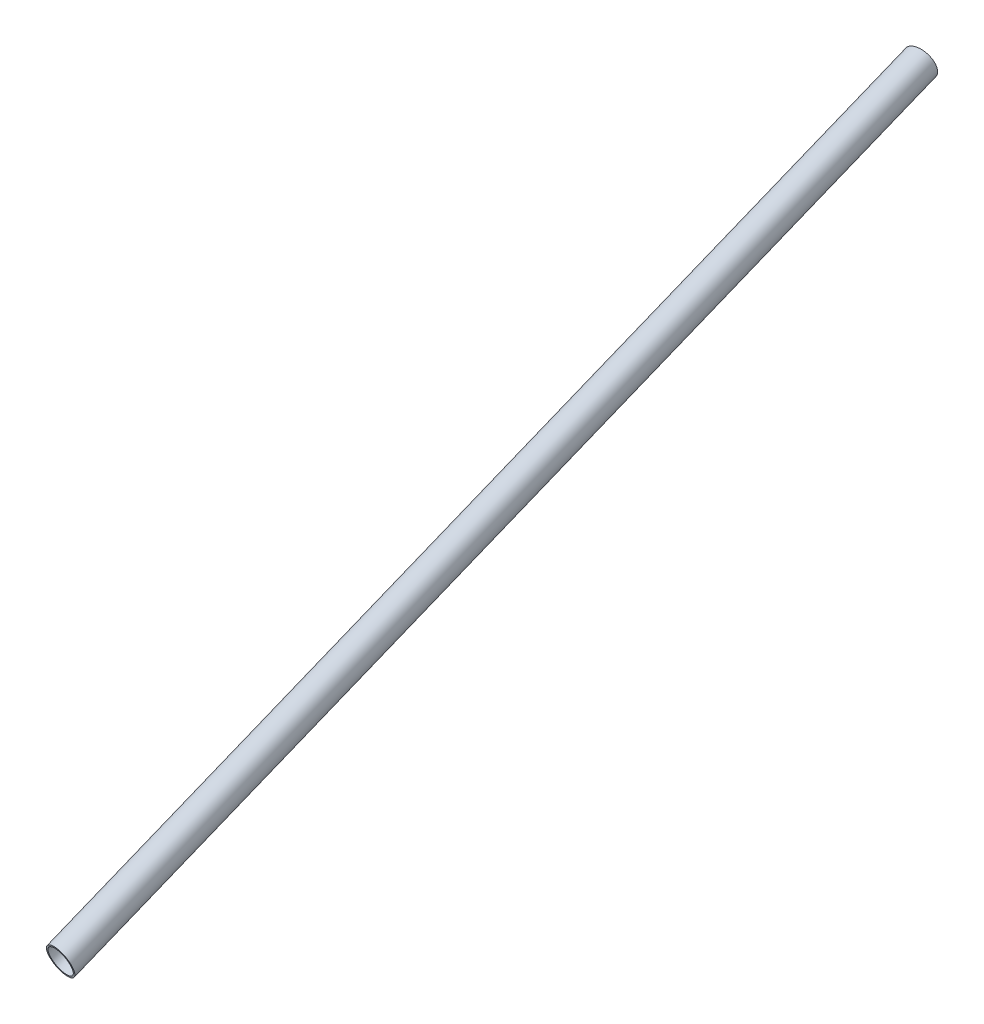
ISO-10303-21;
HEADER;
FILE_DESCRIPTION(('STEP AP214'),'2;1');
FILE_NAME('part.step','',(''),(''),'','','');
FILE_SCHEMA(('AUTOMOTIVE_DESIGN { 1 0 10303 214 1 1 1 1 }'));
ENDSEC;
DATA;
#1=APPLICATION_CONTEXT('core data for automotive mechanical design processes');
#2=APPLICATION_PROTOCOL_DEFINITION('international standard','automotive_design',2000,#1);
#3=PRODUCT_CONTEXT('',#1,'mechanical');
#4=PRODUCT('Part','Part','',(#3));
#5=PRODUCT_RELATED_PRODUCT_CATEGORY('part','',(#4));
#6=PRODUCT_DEFINITION_FORMATION('','',#4);
#7=PRODUCT_DEFINITION_CONTEXT('part definition',#1,'design');
#8=PRODUCT_DEFINITION('design','',#6,#7);
#9=PRODUCT_DEFINITION_SHAPE('','',#8);
#10=(LENGTH_UNIT() NAMED_UNIT(*) SI_UNIT(.MILLI.,.METRE.));
#11=(NAMED_UNIT(*) PLANE_ANGLE_UNIT() SI_UNIT($,.RADIAN.));
#12=(NAMED_UNIT(*) SI_UNIT($,.STERADIAN.) SOLID_ANGLE_UNIT());
#13=UNCERTAINTY_MEASURE_WITH_UNIT(LENGTH_MEASURE(1.E-05),#10,'distance_accuracy_value','');
#14=(GEOMETRIC_REPRESENTATION_CONTEXT(3) GLOBAL_UNCERTAINTY_ASSIGNED_CONTEXT((#13)) GLOBAL_UNIT_ASSIGNED_CONTEXT((#10,
#11,#12)) REPRESENTATION_CONTEXT('',''));
#15=CARTESIAN_POINT('',(0.,0.,0.));
#16=DIRECTION('',(0.,0.,1.));
#17=DIRECTION('',(1.,0.,0.));
#18=AXIS2_PLACEMENT_3D('',#15,#16,#17);
#19=CARTESIAN_POINT('',(-80.,380.,-601.037933611912));
#20=DIRECTION('',(-0.125768324689571,0.215602842324979,-0.968347945155133));
#21=DIRECTION('',(0.,0.976098519192531,0.21732850901377));
#22=AXIS2_PLACEMENT_3D('',#19,#20,#21);
#23=CYLINDRICAL_SURFACE('',#22,7.1);
#24=CARTESIAN_POINT('',(-150.,500.,-1140.));
#25=DIRECTION('',(0.125768324689571,-0.215602842324979,0.968347945155133));
#26=DIRECTION('',(0.991963986075656,0.0137760238703048,-0.125768324689571));
#27=AXIS2_PLACEMENT_3D('',#24,#25,#26);
#28=CIRCLE('',#27,7.1);
#29=CARTESIAN_POINT('',(-142.957055698863,500.097809769479,-1140.8929551053));
#30=VERTEX_POINT('',#29);
#31=EDGE_CURVE('E47',#30,#30,#28,.T.);
#32=ORIENTED_EDGE('',*,*,#31,.F.);
#33=EDGE_LOOP('',(#32));
#34=FACE_BOUND('',#33,.T.);
#35=CARTESIAN_POINT('',(-80.,380.,-601.037933611912));
#36=DIRECTION('',(-0.0966021654991002,-0.31145037677638,0.945339454601751));
#37=DIRECTION('',(-0.909209641489906,-0.358833563956318,-0.211131004829238));
#38=AXIS2_PLACEMENT_3D('',#35,#36,#37);
#39=ELLIPSE('',#38,7.31643769653913,7.1);
#40=CARTESIAN_POINT('',(-86.6521756950536,377.374616585886,-602.582660454553));
#41=VERTEX_POINT('',#40);
#42=EDGE_CURVE('E43',#41,#41,#39,.T.);
#43=ORIENTED_EDGE('',*,*,#42,.T.);
#44=EDGE_LOOP('',(#43));
#45=FACE_BOUND('',#44,.T.);
#46=ADVANCED_FACE('F39',(#34,#45),#23,.F.);
#47=CARTESIAN_POINT('',(-80.,380.,-601.037933611912));
#48=DIRECTION('',(-0.125768324689571,0.215602842324979,-0.968347945155133));
#49=DIRECTION('',(0.,0.976098519192531,0.21732850901377));
#50=AXIS2_PLACEMENT_3D('',#47,#48,#49);
#51=CYLINDRICAL_SURFACE('',#50,8.);
#52=CARTESIAN_POINT('',(-150.,500.,-1140.));
#53=DIRECTION('',(0.125768324689571,-0.215602842324979,0.968347945155133));
#54=DIRECTION('',(0.991963986075656,0.0137760238703048,-0.125768324689571));
#55=AXIS2_PLACEMENT_3D('',#52,#53,#54);
#56=CIRCLE('',#55,8.);
#57=CARTESIAN_POINT('',(-142.064288111395,500.110208190962,-1141.00614659752));
#58=VERTEX_POINT('',#57);
#59=EDGE_CURVE('E51',#58,#58,#56,.T.);
#60=ORIENTED_EDGE('',*,*,#59,.T.);
#61=EDGE_LOOP('',(#60));
#62=FACE_BOUND('',#61,.T.);
#63=CARTESIAN_POINT('',(-80.,380.,-601.037933611912));
#64=DIRECTION('',(-0.0966021654991002,-0.31145037677638,0.945339454601751));
#65=DIRECTION('',(-0.909209641489906,-0.358833563956318,-0.211131004829238));
#66=AXIS2_PLACEMENT_3D('',#63,#64,#65);
#67=ELLIPSE('',#66,8.24387346088917,8.);
#68=CARTESIAN_POINT('',(-87.4954092338632,377.041821505224,-602.778470899395));
#69=VERTEX_POINT('',#68);
#70=EDGE_CURVE('E10',#69,#69,#67,.T.);
#71=ORIENTED_EDGE('',*,*,#70,.F.);
#72=EDGE_LOOP('',(#71));
#73=FACE_BOUND('',#72,.T.);
#74=ADVANCED_FACE('F67',(#62,#73),#51,.T.);
#75=CARTESIAN_POINT('',(-150.,500.,-1140.));
#76=DIRECTION('',(0.125768324689571,-0.215602842324979,0.968347945155133));
#77=DIRECTION('',(0.991963986075656,0.0137760238703048,-0.125768324689571));
#78=AXIS2_PLACEMENT_3D('',#75,#76,#77);
#79=PLANE('',#78);
#80=ORIENTED_EDGE('',*,*,#31,.T.);
#81=EDGE_LOOP('',(#80));
#82=FACE_BOUND('',#81,.T.);
#83=ORIENTED_EDGE('',*,*,#59,.F.);
#84=EDGE_LOOP('',(#83));
#85=FACE_BOUND('',#84,.T.);
#86=ADVANCED_FACE('F62',(#82,#85),#79,.F.);
#87=CARTESIAN_POINT('',(-80.,380.,-601.037933611912));
#88=DIRECTION('',(-0.0966021654991002,-0.31145037677638,0.945339454601751));
#89=DIRECTION('',(0.,-0.949781512459289,-0.312913851707695));
#90=AXIS2_PLACEMENT_3D('',#87,#88,#89);
#91=PLANE('',#90);
#92=ORIENTED_EDGE('',*,*,#42,.F.);
#93=EDGE_LOOP('',(#92));
#94=FACE_BOUND('',#93,.T.);
#95=ORIENTED_EDGE('',*,*,#70,.T.);
#96=EDGE_LOOP('',(#95));
#97=FACE_BOUND('',#96,.T.);
#98=ADVANCED_FACE('F41',(#94,#97),#91,.T.);
#99=CLOSED_SHELL('',(#46,#74,#86,#98));
#100=MANIFOLD_SOLID_BREP('B2',#99);
#101=ADVANCED_BREP_SHAPE_REPRESENTATION('',(#18,#100),#14);
#102=SHAPE_DEFINITION_REPRESENTATION(#9,#101);
ENDSEC;
END-ISO-10303-21;
